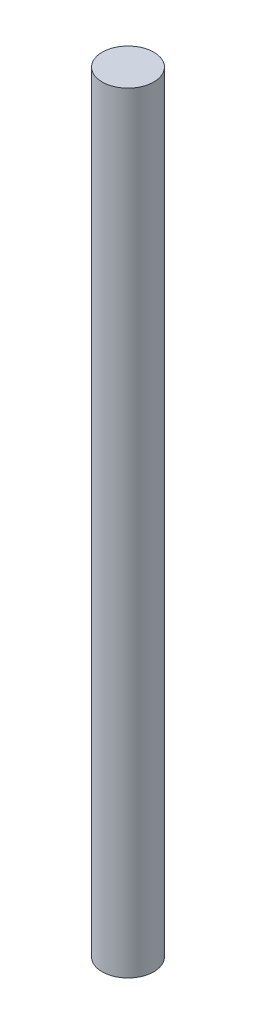
ISO-10303-21;
HEADER;
FILE_DESCRIPTION(('STEP AP214'),'2;1');
FILE_NAME('part.step','',(''),(''),'','','');
FILE_SCHEMA(('AUTOMOTIVE_DESIGN { 1 0 10303 214 1 1 1 1 }'));
ENDSEC;
DATA;
#1=APPLICATION_CONTEXT('core data for automotive mechanical design processes');
#2=APPLICATION_PROTOCOL_DEFINITION('international standard','automotive_design',2000,#1);
#3=PRODUCT_CONTEXT('',#1,'mechanical');
#4=PRODUCT('Part','Part','',(#3));
#5=PRODUCT_RELATED_PRODUCT_CATEGORY('part','',(#4));
#6=PRODUCT_DEFINITION_FORMATION('','',#4);
#7=PRODUCT_DEFINITION_CONTEXT('part definition',#1,'design');
#8=PRODUCT_DEFINITION('design','',#6,#7);
#9=PRODUCT_DEFINITION_SHAPE('','',#8);
#10=(LENGTH_UNIT() NAMED_UNIT(*) SI_UNIT(.MILLI.,.METRE.));
#11=(NAMED_UNIT(*) PLANE_ANGLE_UNIT() SI_UNIT($,.RADIAN.));
#12=(NAMED_UNIT(*) SI_UNIT($,.STERADIAN.) SOLID_ANGLE_UNIT());
#13=UNCERTAINTY_MEASURE_WITH_UNIT(LENGTH_MEASURE(1.E-05),#10,'distance_accuracy_value','');
#14=(GEOMETRIC_REPRESENTATION_CONTEXT(3) GLOBAL_UNCERTAINTY_ASSIGNED_CONTEXT((#13)) GLOBAL_UNIT_ASSIGNED_CONTEXT((#10,
#11,#12)) REPRESENTATION_CONTEXT('',''));
#15=CARTESIAN_POINT('',(0.,0.,0.));
#16=DIRECTION('',(0.,0.,1.));
#17=DIRECTION('',(1.,0.,0.));
#18=AXIS2_PLACEMENT_3D('',#15,#16,#17);
#19=CARTESIAN_POINT('',(0.,41.8,0.));
#20=DIRECTION('',(0.,-1.,0.));
#21=DIRECTION('',(0.,0.,-1.));
#22=AXIS2_PLACEMENT_3D('',#19,#20,#21);
#23=CYLINDRICAL_SURFACE('',#22,1.4);
#24=CARTESIAN_POINT('',(0.,41.8,0.));
#25=DIRECTION('',(0.,1.,0.));
#26=DIRECTION('',(0.,0.,1.));
#27=AXIS2_PLACEMENT_3D('',#24,#25,#26);
#28=CIRCLE('',#27,1.4);
#29=CARTESIAN_POINT('',(0.,41.8,1.4));
#30=VERTEX_POINT('',#29);
#31=EDGE_CURVE('E10',#30,#30,#28,.T.);
#32=ORIENTED_EDGE('',*,*,#31,.F.);
#33=EDGE_LOOP('',(#32));
#34=FACE_BOUND('',#33,.T.);
#35=CARTESIAN_POINT('',(0.,0.,0.));
#36=DIRECTION('',(0.,1.,0.));
#37=DIRECTION('',(0.,0.,1.));
#38=AXIS2_PLACEMENT_3D('',#35,#36,#37);
#39=CIRCLE('',#38,1.4);
#40=CARTESIAN_POINT('',(0.,0.,1.4));
#41=VERTEX_POINT('',#40);
#42=EDGE_CURVE('E36',#41,#41,#39,.T.);
#43=ORIENTED_EDGE('',*,*,#42,.T.);
#44=EDGE_LOOP('',(#43));
#45=FACE_BOUND('',#44,.T.);
#46=ADVANCED_FACE('F33',(#34,#45),#23,.T.);
#47=CARTESIAN_POINT('',(0.,41.8,0.));
#48=DIRECTION('',(0.,1.,0.));
#49=DIRECTION('',(0.,0.,1.));
#50=AXIS2_PLACEMENT_3D('',#47,#48,#49);
#51=PLANE('',#50);
#52=ORIENTED_EDGE('',*,*,#31,.T.);
#53=EDGE_LOOP('',(#52));
#54=FACE_BOUND('',#53,.T.);
#55=ADVANCED_FACE('F48',(#54),#51,.T.);
#56=CARTESIAN_POINT('',(0.,0.,0.));
#57=DIRECTION('',(0.,1.,0.));
#58=DIRECTION('',(0.,0.,1.));
#59=AXIS2_PLACEMENT_3D('',#56,#57,#58);
#60=PLANE('',#59);
#61=ORIENTED_EDGE('',*,*,#42,.F.);
#62=EDGE_LOOP('',(#61));
#63=FACE_BOUND('',#62,.T.);
#64=ADVANCED_FACE('F46',(#63),#60,.F.);
#65=CLOSED_SHELL('',(#46,#55,#64));
#66=MANIFOLD_SOLID_BREP('B2',#65);
#67=ADVANCED_BREP_SHAPE_REPRESENTATION('',(#18,#66),#14);
#68=SHAPE_DEFINITION_REPRESENTATION(#9,#67);
ENDSEC;
END-ISO-10303-21;
